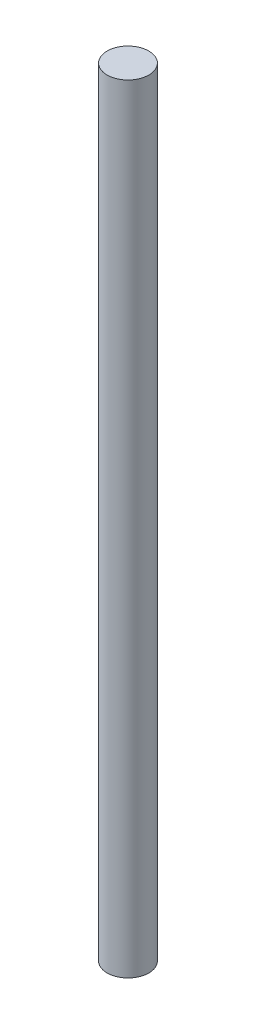
ISO-10303-21;
HEADER;
FILE_DESCRIPTION(('STEP AP214'),'2;1');
FILE_NAME('part.step','',(''),(''),'','','');
FILE_SCHEMA(('AUTOMOTIVE_DESIGN { 1 0 10303 214 1 1 1 1 }'));
ENDSEC;
DATA;
#1=APPLICATION_CONTEXT('core data for automotive mechanical design processes');
#2=APPLICATION_PROTOCOL_DEFINITION('international standard','automotive_design',2000,#1);
#3=PRODUCT_CONTEXT('',#1,'mechanical');
#4=PRODUCT('Part','Part','',(#3));
#5=PRODUCT_RELATED_PRODUCT_CATEGORY('part','',(#4));
#6=PRODUCT_DEFINITION_FORMATION('','',#4);
#7=PRODUCT_DEFINITION_CONTEXT('part definition',#1,'design');
#8=PRODUCT_DEFINITION('design','',#6,#7);
#9=PRODUCT_DEFINITION_SHAPE('','',#8);
#10=(LENGTH_UNIT() NAMED_UNIT(*) SI_UNIT(.MILLI.,.METRE.));
#11=(NAMED_UNIT(*) PLANE_ANGLE_UNIT() SI_UNIT($,.RADIAN.));
#12=(NAMED_UNIT(*) SI_UNIT($,.STERADIAN.) SOLID_ANGLE_UNIT());
#13=UNCERTAINTY_MEASURE_WITH_UNIT(LENGTH_MEASURE(1.E-05),#10,'distance_accuracy_value','');
#14=(GEOMETRIC_REPRESENTATION_CONTEXT(3) GLOBAL_UNCERTAINTY_ASSIGNED_CONTEXT((#13)) GLOBAL_UNIT_ASSIGNED_CONTEXT((#10,
#11,#12)) REPRESENTATION_CONTEXT('',''));
#15=CARTESIAN_POINT('',(0.,0.,0.));
#16=DIRECTION('',(0.,0.,1.));
#17=DIRECTION('',(1.,0.,0.));
#18=AXIS2_PLACEMENT_3D('',#15,#16,#17);
#19=CARTESIAN_POINT('',(0.,177.8,0.));
#20=DIRECTION('',(0.,-1.,0.));
#21=DIRECTION('',(0.,0.,-1.));
#22=AXIS2_PLACEMENT_3D('',#19,#20,#21);
#23=CYLINDRICAL_SURFACE('',#22,4.7625);
#24=CARTESIAN_POINT('',(0.,177.8,0.));
#25=DIRECTION('',(0.,1.,0.));
#26=DIRECTION('',(0.,0.,1.));
#27=AXIS2_PLACEMENT_3D('',#24,#25,#26);
#28=CIRCLE('',#27,4.7625);
#29=CARTESIAN_POINT('',(0.,177.8,4.7625));
#30=VERTEX_POINT('',#29);
#31=EDGE_CURVE('E10',#30,#30,#28,.T.);
#32=ORIENTED_EDGE('',*,*,#31,.F.);
#33=EDGE_LOOP('',(#32));
#34=FACE_BOUND('',#33,.T.);
#35=CARTESIAN_POINT('',(0.,0.,0.));
#36=DIRECTION('',(0.,1.,0.));
#37=DIRECTION('',(0.,0.,1.));
#38=AXIS2_PLACEMENT_3D('',#35,#36,#37);
#39=CIRCLE('',#38,4.7625);
#40=CARTESIAN_POINT('',(0.,0.,4.7625));
#41=VERTEX_POINT('',#40);
#42=EDGE_CURVE('E33',#41,#41,#39,.T.);
#43=ORIENTED_EDGE('',*,*,#42,.T.);
#44=EDGE_LOOP('',(#43));
#45=FACE_BOUND('',#44,.T.);
#46=ADVANCED_FACE('F30',(#34,#45),#23,.T.);
#47=CARTESIAN_POINT('',(0.,177.8,0.));
#48=DIRECTION('',(0.,1.,0.));
#49=DIRECTION('',(0.,0.,1.));
#50=AXIS2_PLACEMENT_3D('',#47,#48,#49);
#51=PLANE('',#50);
#52=ORIENTED_EDGE('',*,*,#31,.T.);
#53=EDGE_LOOP('',(#52));
#54=FACE_BOUND('',#53,.T.);
#55=ADVANCED_FACE('F45',(#54),#51,.T.);
#56=CARTESIAN_POINT('',(0.,0.,0.));
#57=DIRECTION('',(0.,1.,0.));
#58=DIRECTION('',(0.,0.,1.));
#59=AXIS2_PLACEMENT_3D('',#56,#57,#58);
#60=PLANE('',#59);
#61=ORIENTED_EDGE('',*,*,#42,.F.);
#62=EDGE_LOOP('',(#61));
#63=FACE_BOUND('',#62,.T.);
#64=ADVANCED_FACE('F43',(#63),#60,.F.);
#65=CLOSED_SHELL('',(#46,#55,#64));
#66=MANIFOLD_SOLID_BREP('B2',#65);
#67=ADVANCED_BREP_SHAPE_REPRESENTATION('',(#18,#66),#14);
#68=SHAPE_DEFINITION_REPRESENTATION(#9,#67);
ENDSEC;
END-ISO-10303-21;
